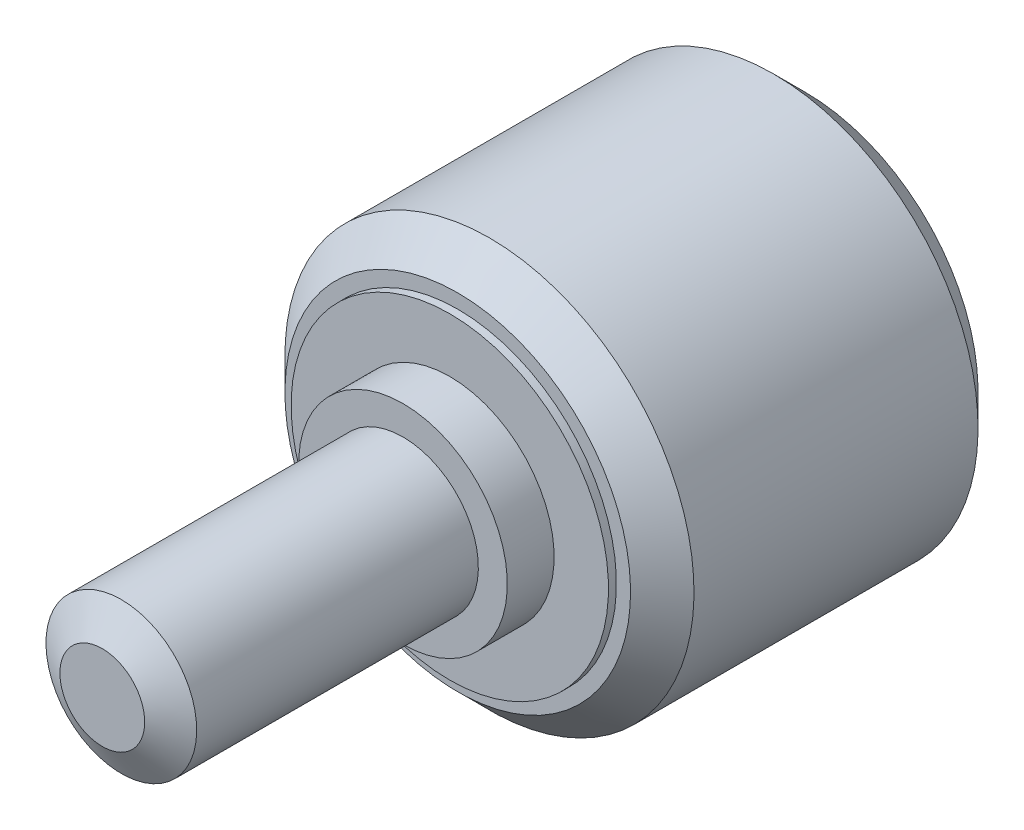
ISO-10303-21;
HEADER;
FILE_DESCRIPTION(('STEP AP214'),'2;1');
FILE_NAME('part.step','',(''),(''),'','','');
FILE_SCHEMA(('AUTOMOTIVE_DESIGN { 1 0 10303 214 1 1 1 1 }'));
ENDSEC;
DATA;
#1=APPLICATION_CONTEXT('core data for automotive mechanical design processes');
#2=APPLICATION_PROTOCOL_DEFINITION('international standard','automotive_design',2000,#1);
#3=PRODUCT_CONTEXT('',#1,'mechanical');
#4=PRODUCT('Part','Part','',(#3));
#5=PRODUCT_RELATED_PRODUCT_CATEGORY('part','',(#4));
#6=PRODUCT_DEFINITION_FORMATION('','',#4);
#7=PRODUCT_DEFINITION_CONTEXT('part definition',#1,'design');
#8=PRODUCT_DEFINITION('design','',#6,#7);
#9=PRODUCT_DEFINITION_SHAPE('','',#8);
#10=(LENGTH_UNIT() NAMED_UNIT(*) SI_UNIT(.MILLI.,.METRE.));
#11=(NAMED_UNIT(*) PLANE_ANGLE_UNIT() SI_UNIT($,.RADIAN.));
#12=(NAMED_UNIT(*) SI_UNIT($,.STERADIAN.) SOLID_ANGLE_UNIT());
#13=UNCERTAINTY_MEASURE_WITH_UNIT(LENGTH_MEASURE(1.E-05),#10,'distance_accuracy_value','');
#14=(GEOMETRIC_REPRESENTATION_CONTEXT(3) GLOBAL_UNCERTAINTY_ASSIGNED_CONTEXT((#13)) GLOBAL_UNIT_ASSIGNED_CONTEXT((#10,
#11,#12)) REPRESENTATION_CONTEXT('',''));
#15=CARTESIAN_POINT('',(0.,0.,0.));
#16=DIRECTION('',(0.,0.,1.));
#17=DIRECTION('',(1.,0.,0.));
#18=AXIS2_PLACEMENT_3D('',#15,#16,#17);
#19=CARTESIAN_POINT('',(0.,0.,11.1252));
#20=DIRECTION('',(0.,0.,-1.));
#21=DIRECTION('',(0.,1.,0.));
#22=AXIS2_PLACEMENT_3D('',#19,#20,#21);
#23=CYLINDRICAL_SURFACE('',#22,2.413);
#24=CARTESIAN_POINT('',(0.,0.,10.5156));
#25=DIRECTION('',(0.,0.,-1.));
#26=DIRECTION('',(0.,1.,0.));
#27=AXIS2_PLACEMENT_3D('',#24,#25,#26);
#28=CIRCLE('',#27,2.413);
#29=CARTESIAN_POINT('',(0.,2.413,10.5156));
#30=VERTEX_POINT('',#29);
#31=EDGE_CURVE('E10',#30,#30,#28,.T.);
#32=ORIENTED_EDGE('',*,*,#31,.T.);
#33=EDGE_LOOP('',(#32));
#34=FACE_BOUND('',#33,.T.);
#35=CARTESIAN_POINT('',(0.,0.,1.4986));
#36=DIRECTION('',(0.,0.,-1.));
#37=DIRECTION('',(0.,1.,0.));
#38=AXIS2_PLACEMENT_3D('',#35,#36,#37);
#39=CIRCLE('',#38,2.413);
#40=CARTESIAN_POINT('',(0.,2.413,1.4986));
#41=VERTEX_POINT('',#40);
#42=EDGE_CURVE('E71',#41,#41,#39,.T.);
#43=ORIENTED_EDGE('',*,*,#42,.F.);
#44=EDGE_LOOP('',(#43));
#45=FACE_BOUND('',#44,.T.);
#46=ADVANCED_FACE('F34',(#34,#45),#23,.T.);
#47=CARTESIAN_POINT('',(0.,0.,10.5156));
#48=DIRECTION('',(0.,0.,-1.));
#49=DIRECTION('',(0.,1.,0.));
#50=AXIS2_PLACEMENT_3D('',#47,#48,#49);
#51=CONICAL_SURFACE('',#50,2.413,1.0471975511966);
#52=CARTESIAN_POINT('',(0.,0.,11.1252));
#53=DIRECTION('',(0.,0.,-1.));
#54=DIRECTION('',(0.,1.,0.));
#55=AXIS2_PLACEMENT_3D('',#52,#53,#54);
#56=CIRCLE('',#55,1.357141827706);
#57=CARTESIAN_POINT('',(0.,1.357141827706,11.1252));
#58=VERTEX_POINT('',#57);
#59=EDGE_CURVE('E40',#58,#58,#56,.T.);
#60=ORIENTED_EDGE('',*,*,#59,.T.);
#61=EDGE_LOOP('',(#60));
#62=FACE_BOUND('',#61,.T.);
#63=ORIENTED_EDGE('',*,*,#31,.F.);
#64=EDGE_LOOP('',(#63));
#65=FACE_BOUND('',#64,.T.);
#66=ADVANCED_FACE('F79',(#62,#65),#51,.T.);
#67=CARTESIAN_POINT('',(0.,0.,11.1252));
#68=DIRECTION('',(0.,0.,1.));
#69=DIRECTION('',(0.,-1.,0.));
#70=AXIS2_PLACEMENT_3D('',#67,#68,#69);
#71=PLANE('',#70);
#72=ORIENTED_EDGE('',*,*,#59,.F.);
#73=EDGE_LOOP('',(#72));
#74=FACE_BOUND('',#73,.T.);
#75=ADVANCED_FACE('F83',(#74),#71,.T.);
#76=CARTESIAN_POINT('',(0.,5.53243749999999,-11.3792));
#77=DIRECTION('',(0.,0.,-1.));
#78=DIRECTION('',(0.,1.,0.));
#79=AXIS2_PLACEMENT_3D('',#76,#77,#78);
#80=PLANE('',#79);
#81=CARTESIAN_POINT('',(0.,0.,-11.3792));
#82=DIRECTION('',(0.,0.,-1.));
#83=DIRECTION('',(0.,1.,0.));
#84=AXIS2_PLACEMENT_3D('',#81,#82,#83);
#85=CIRCLE('',#84,5.53243749999999);
#86=CARTESIAN_POINT('',(0.,5.53243749999999,-11.3792));
#87=VERTEX_POINT('',#86);
#88=EDGE_CURVE('E44',#87,#87,#85,.T.);
#89=ORIENTED_EDGE('',*,*,#88,.T.);
#90=EDGE_LOOP('',(#89));
#91=FACE_BOUND('',#90,.T.);
#92=ADVANCED_FACE('F87',(#91),#80,.T.);
#93=CARTESIAN_POINT('',(0.,0.,-11.3792));
#94=DIRECTION('',(0.,0.,1.));
#95=DIRECTION('',(0.,-1.,0.));
#96=AXIS2_PLACEMENT_3D('',#93,#94,#95);
#97=CONICAL_SURFACE('',#96,5.53243749999999,0.78539816339745);
#98=CARTESIAN_POINT('',(0.,0.,-10.3632));
#99=DIRECTION('',(0.,0.,-1.));
#100=DIRECTION('',(0.,1.,0.));
#101=AXIS2_PLACEMENT_3D('',#98,#99,#100);
#102=CIRCLE('',#101,6.5484375);
#103=CARTESIAN_POINT('',(0.,6.5484375,-10.3632));
#104=VERTEX_POINT('',#103);
#105=EDGE_CURVE('E48',#104,#104,#102,.T.);
#106=ORIENTED_EDGE('',*,*,#105,.T.);
#107=EDGE_LOOP('',(#106));
#108=FACE_BOUND('',#107,.T.);
#109=ORIENTED_EDGE('',*,*,#88,.F.);
#110=EDGE_LOOP('',(#109));
#111=FACE_BOUND('',#110,.T.);
#112=ADVANCED_FACE('F94',(#108,#111),#97,.T.);
#113=CARTESIAN_POINT('',(0.,0.,11.1252));
#114=DIRECTION('',(0.,0.,-1.));
#115=DIRECTION('',(0.,1.,0.));
#116=AXIS2_PLACEMENT_3D('',#113,#114,#115);
#117=CYLINDRICAL_SURFACE('',#116,6.5484375);
#118=CARTESIAN_POINT('',(0.,0.,-1.27));
#119=DIRECTION('',(0.,0.,-1.));
#120=DIRECTION('',(0.,1.,0.));
#121=AXIS2_PLACEMENT_3D('',#118,#119,#120);
#122=CIRCLE('',#121,6.5484375);
#123=CARTESIAN_POINT('',(0.,6.5484375,-1.27));
#124=VERTEX_POINT('',#123);
#125=EDGE_CURVE('E53',#124,#124,#122,.T.);
#126=ORIENTED_EDGE('',*,*,#125,.T.);
#127=EDGE_LOOP('',(#126));
#128=FACE_BOUND('',#127,.T.);
#129=ORIENTED_EDGE('',*,*,#105,.F.);
#130=EDGE_LOOP('',(#129));
#131=FACE_BOUND('',#130,.T.);
#132=ADVANCED_FACE('F98',(#128,#131),#117,.T.);
#133=CARTESIAN_POINT('',(0.,0.,-1.27));
#134=DIRECTION('',(0.,0.,-1.));
#135=DIRECTION('',(0.,1.,0.));
#136=AXIS2_PLACEMENT_3D('',#133,#134,#135);
#137=CONICAL_SURFACE('',#136,6.5484375,0.785398163397446);
#138=CARTESIAN_POINT('',(0.,0.,-0.253999999999999));
#139=DIRECTION('',(0.,0.,-1.));
#140=DIRECTION('',(0.,1.,0.));
#141=AXIS2_PLACEMENT_3D('',#138,#139,#140);
#142=CIRCLE('',#141,5.5324375);
#143=CARTESIAN_POINT('',(0.,5.5324375,-0.253999999999999));
#144=VERTEX_POINT('',#143);
#145=EDGE_CURVE('E56',#144,#144,#142,.T.);
#146=ORIENTED_EDGE('',*,*,#145,.T.);
#147=EDGE_LOOP('',(#146));
#148=FACE_BOUND('',#147,.T.);
#149=ORIENTED_EDGE('',*,*,#125,.F.);
#150=EDGE_LOOP('',(#149));
#151=FACE_BOUND('',#150,.T.);
#152=ADVANCED_FACE('F102',(#148,#151),#137,.T.);
#153=CARTESIAN_POINT('',(0.,5.08,-0.254));
#154=DIRECTION('',(0.,0.,1.));
#155=DIRECTION('',(0.,-1.,0.));
#156=AXIS2_PLACEMENT_3D('',#153,#154,#155);
#157=PLANE('',#156);
#158=CARTESIAN_POINT('',(0.,0.,-0.253999999999999));
#159=DIRECTION('',(0.,0.,-1.));
#160=DIRECTION('',(0.,1.,0.));
#161=AXIS2_PLACEMENT_3D('',#158,#159,#160);
#162=CIRCLE('',#161,5.08);
#163=CARTESIAN_POINT('',(0.,5.08,-0.253999999999999));
#164=VERTEX_POINT('',#163);
#165=EDGE_CURVE('E59',#164,#164,#162,.T.);
#166=ORIENTED_EDGE('',*,*,#165,.T.);
#167=EDGE_LOOP('',(#166));
#168=FACE_BOUND('',#167,.T.);
#169=ORIENTED_EDGE('',*,*,#145,.F.);
#170=EDGE_LOOP('',(#169));
#171=FACE_BOUND('',#170,.T.);
#172=ADVANCED_FACE('F106',(#168,#171),#157,.T.);
#173=CARTESIAN_POINT('',(0.,0.,11.1252));
#174=DIRECTION('',(0.,0.,-1.));
#175=DIRECTION('',(0.,1.,0.));
#176=AXIS2_PLACEMENT_3D('',#173,#174,#175);
#177=CYLINDRICAL_SURFACE('',#176,5.08);
#178=CARTESIAN_POINT('',(0.,0.,0.));
#179=DIRECTION('',(0.,0.,-1.));
#180=DIRECTION('',(0.,1.,0.));
#181=AXIS2_PLACEMENT_3D('',#178,#179,#180);
#182=CIRCLE('',#181,5.08);
#183=CARTESIAN_POINT('',(0.,5.08,0.));
#184=VERTEX_POINT('',#183);
#185=EDGE_CURVE('E62',#184,#184,#182,.T.);
#186=ORIENTED_EDGE('',*,*,#185,.T.);
#187=EDGE_LOOP('',(#186));
#188=FACE_BOUND('',#187,.T.);
#189=ORIENTED_EDGE('',*,*,#165,.F.);
#190=EDGE_LOOP('',(#189));
#191=FACE_BOUND('',#190,.T.);
#192=ADVANCED_FACE('F110',(#188,#191),#177,.T.);
#193=CARTESIAN_POINT('',(0.,5.08,0.));
#194=DIRECTION('',(0.,0.,1.));
#195=DIRECTION('',(0.,-1.,0.));
#196=AXIS2_PLACEMENT_3D('',#193,#194,#195);
#197=PLANE('',#196);
#198=CARTESIAN_POINT('',(0.,0.,0.));
#199=DIRECTION('',(0.,0.,-1.));
#200=DIRECTION('',(0.,1.,0.));
#201=AXIS2_PLACEMENT_3D('',#198,#199,#200);
#202=CIRCLE('',#201,3.3401);
#203=CARTESIAN_POINT('',(0.,3.3401,0.));
#204=VERTEX_POINT('',#203);
#205=EDGE_CURVE('E65',#204,#204,#202,.T.);
#206=ORIENTED_EDGE('',*,*,#205,.T.);
#207=EDGE_LOOP('',(#206));
#208=FACE_BOUND('',#207,.T.);
#209=ORIENTED_EDGE('',*,*,#185,.F.);
#210=EDGE_LOOP('',(#209));
#211=FACE_BOUND('',#210,.T.);
#212=ADVANCED_FACE('F114',(#208,#211),#197,.T.);
#213=CARTESIAN_POINT('',(0.,0.,11.1252));
#214=DIRECTION('',(0.,0.,-1.));
#215=DIRECTION('',(0.,1.,0.));
#216=AXIS2_PLACEMENT_3D('',#213,#214,#215);
#217=CYLINDRICAL_SURFACE('',#216,3.3401);
#218=CARTESIAN_POINT('',(0.,0.,1.4986));
#219=DIRECTION('',(0.,0.,-1.));
#220=DIRECTION('',(0.,1.,0.));
#221=AXIS2_PLACEMENT_3D('',#218,#219,#220);
#222=CIRCLE('',#221,3.3401);
#223=CARTESIAN_POINT('',(0.,3.3401,1.4986));
#224=VERTEX_POINT('',#223);
#225=EDGE_CURVE('E68',#224,#224,#222,.T.);
#226=ORIENTED_EDGE('',*,*,#225,.T.);
#227=EDGE_LOOP('',(#226));
#228=FACE_BOUND('',#227,.T.);
#229=ORIENTED_EDGE('',*,*,#205,.F.);
#230=EDGE_LOOP('',(#229));
#231=FACE_BOUND('',#230,.T.);
#232=ADVANCED_FACE('F118',(#228,#231),#217,.T.);
#233=CARTESIAN_POINT('',(0.,2.413,1.4986));
#234=DIRECTION('',(0.,0.,1.));
#235=DIRECTION('',(0.,-1.,0.));
#236=AXIS2_PLACEMENT_3D('',#233,#234,#235);
#237=PLANE('',#236);
#238=ORIENTED_EDGE('',*,*,#42,.T.);
#239=EDGE_LOOP('',(#238));
#240=FACE_BOUND('',#239,.T.);
#241=ORIENTED_EDGE('',*,*,#225,.F.);
#242=EDGE_LOOP('',(#241));
#243=FACE_BOUND('',#242,.T.);
#244=ADVANCED_FACE('F75',(#240,#243),#237,.T.);
#245=CLOSED_SHELL('',(#46,#66,#75,#92,#112,#132,#152,#172,#192,#212,#232,#244));
#246=MANIFOLD_SOLID_BREP('B2',#245);
#247=ADVANCED_BREP_SHAPE_REPRESENTATION('',(#18,#246),#14);
#248=SHAPE_DEFINITION_REPRESENTATION(#9,#247);
ENDSEC;
END-ISO-10303-21;
